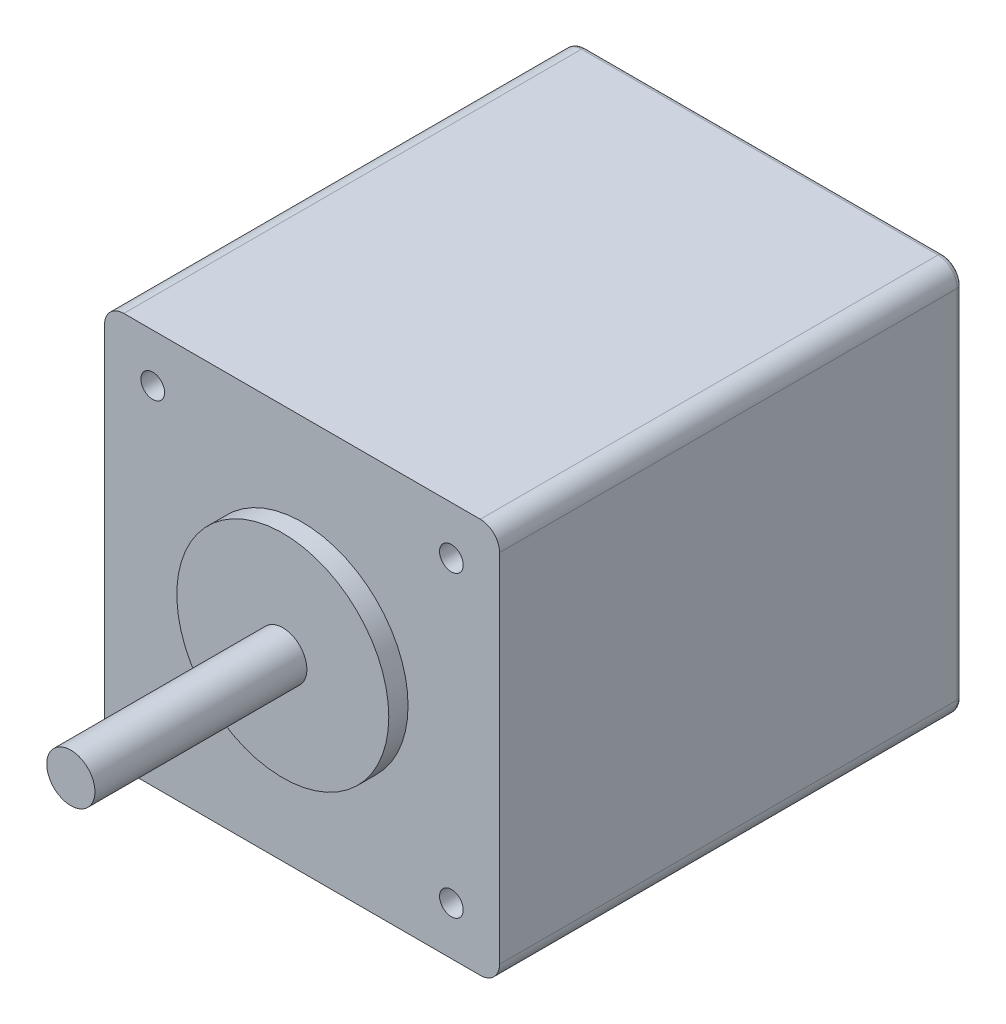
ISO-10303-21;
HEADER;
FILE_DESCRIPTION(('STEP AP214'),'2;1');
FILE_NAME('part.step','',(''),(''),'','','');
FILE_SCHEMA(('AUTOMOTIVE_DESIGN { 1 0 10303 214 1 1 1 1 }'));
ENDSEC;
DATA;
#1=APPLICATION_CONTEXT('core data for automotive mechanical design processes');
#2=APPLICATION_PROTOCOL_DEFINITION('international standard','automotive_design',2000,#1);
#3=PRODUCT_CONTEXT('',#1,'mechanical');
#4=PRODUCT('Part','Part','',(#3));
#5=PRODUCT_RELATED_PRODUCT_CATEGORY('part','',(#4));
#6=PRODUCT_DEFINITION_FORMATION('','',#4);
#7=PRODUCT_DEFINITION_CONTEXT('part definition',#1,'design');
#8=PRODUCT_DEFINITION('design','',#6,#7);
#9=PRODUCT_DEFINITION_SHAPE('','',#8);
#10=(LENGTH_UNIT() NAMED_UNIT(*) SI_UNIT(.MILLI.,.METRE.));
#11=(NAMED_UNIT(*) PLANE_ANGLE_UNIT() SI_UNIT($,.RADIAN.));
#12=(NAMED_UNIT(*) SI_UNIT($,.STERADIAN.) SOLID_ANGLE_UNIT());
#13=UNCERTAINTY_MEASURE_WITH_UNIT(LENGTH_MEASURE(1.E-05),#10,'distance_accuracy_value','');
#14=(GEOMETRIC_REPRESENTATION_CONTEXT(3) GLOBAL_UNCERTAINTY_ASSIGNED_CONTEXT((#13)) GLOBAL_UNIT_ASSIGNED_CONTEXT((#10,
#11,#12)) REPRESENTATION_CONTEXT('',''));
#15=CARTESIAN_POINT('',(0.,0.,0.));
#16=DIRECTION('',(0.,0.,1.));
#17=DIRECTION('',(1.,0.,0.));
#18=AXIS2_PLACEMENT_3D('',#15,#16,#17);
#19=CARTESIAN_POINT('',(-41.,0.,0.));
#20=DIRECTION('',(-1.,0.,0.));
#21=DIRECTION('',(0.,0.,1.));
#22=AXIS2_PLACEMENT_3D('',#19,#20,#21);
#23=PLANE('',#22);
#24=DIRECTION('',(0.,0.,1.));
#25=VECTOR('',#24,1.);
#26=CARTESIAN_POINT('',(-41.,39.,0.));
#27=LINE('',#26,#25);
#28=CARTESIAN_POINT('',(-41.,39.,48.));
#29=VERTEX_POINT('',#28);
#30=CARTESIAN_POINT('',(-41.,39.,0.499999999999999));
#31=VERTEX_POINT('',#30);
#32=EDGE_CURVE('E134',#29,#31,#27,.F.);
#33=ORIENTED_EDGE('',*,*,#32,.T.);
#34=DIRECTION('',(0.,1.,0.));
#35=VECTOR('',#34,1.);
#36=CARTESIAN_POINT('',(-41.,0.,0.499999999999999));
#37=LINE('',#36,#35);
#38=CARTESIAN_POINT('',(-41.,2.,0.5));
#39=VERTEX_POINT('',#38);
#40=EDGE_CURVE('E205',#31,#39,#37,.F.);
#41=ORIENTED_EDGE('',*,*,#40,.T.);
#42=DIRECTION('',(0.,0.,1.));
#43=VECTOR('',#42,1.);
#44=CARTESIAN_POINT('',(-41.,2.,48.));
#45=LINE('',#44,#43);
#46=CARTESIAN_POINT('',(-41.,2.,48.));
#47=VERTEX_POINT('',#46);
#48=EDGE_CURVE('E138',#39,#47,#45,.T.);
#49=ORIENTED_EDGE('',*,*,#48,.T.);
#50=DIRECTION('',(0.,1.,0.));
#51=VECTOR('',#50,1.);
#52=CARTESIAN_POINT('',(-41.,0.,48.));
#53=LINE('',#52,#51);
#54=EDGE_CURVE('E148',#47,#29,#53,.T.);
#55=ORIENTED_EDGE('',*,*,#54,.T.);
#56=EDGE_LOOP('',(#33,#41,#49,#55));
#57=FACE_BOUND('',#56,.T.);
#58=ADVANCED_FACE('F35',(#57),#23,.T.);
#59=CARTESIAN_POINT('',(0.,0.,0.));
#60=DIRECTION('',(0.,0.,-1.));
#61=DIRECTION('',(-1.,0.,0.));
#62=AXIS2_PLACEMENT_3D('',#59,#60,#61);
#63=PLANE('',#62);
#64=DIRECTION('',(0.,1.,0.));
#65=VECTOR('',#64,1.);
#66=CARTESIAN_POINT('',(-0.499999999999999,0.,0.));
#67=LINE('',#66,#65);
#68=CARTESIAN_POINT('',(-0.499999999999999,39.,0.));
#69=VERTEX_POINT('',#68);
#70=CARTESIAN_POINT('',(-0.499999999999999,2.,0.));
#71=VERTEX_POINT('',#70);
#72=EDGE_CURVE('E187',#69,#71,#67,.F.);
#73=ORIENTED_EDGE('',*,*,#72,.T.);
#74=CARTESIAN_POINT('',(-2.,2.,0.));
#75=DIRECTION('',(0.,0.,-1.));
#76=DIRECTION('',(-1.,0.,0.));
#77=AXIS2_PLACEMENT_3D('',#74,#75,#76);
#78=CIRCLE('',#77,1.5);
#79=CARTESIAN_POINT('',(-2.,0.499999999999999,0.));
#80=VERTEX_POINT('',#79);
#81=EDGE_CURVE('E191',#71,#80,#78,.T.);
#82=ORIENTED_EDGE('',*,*,#81,.T.);
#83=DIRECTION('',(-1.,0.,0.));
#84=VECTOR('',#83,1.);
#85=CARTESIAN_POINT('',(-39.,0.499999999999999,0.));
#86=LINE('',#85,#84);
#87=CARTESIAN_POINT('',(-39.,0.499999999999999,0.));
#88=VERTEX_POINT('',#87);
#89=EDGE_CURVE('E189',#80,#88,#86,.T.);
#90=ORIENTED_EDGE('',*,*,#89,.T.);
#91=CARTESIAN_POINT('',(-39.,2.,0.));
#92=DIRECTION('',(0.,0.,-1.));
#93=DIRECTION('',(-1.,0.,0.));
#94=AXIS2_PLACEMENT_3D('',#91,#92,#93);
#95=CIRCLE('',#94,1.5);
#96=CARTESIAN_POINT('',(-40.5,2.,0.));
#97=VERTEX_POINT('',#96);
#98=EDGE_CURVE('E185',#88,#97,#95,.T.);
#99=ORIENTED_EDGE('',*,*,#98,.T.);
#100=DIRECTION('',(0.,1.,0.));
#101=VECTOR('',#100,1.);
#102=CARTESIAN_POINT('',(-40.5,0.,0.));
#103=LINE('',#102,#101);
#104=CARTESIAN_POINT('',(-40.5,39.,0.));
#105=VERTEX_POINT('',#104);
#106=EDGE_CURVE('E181',#97,#105,#103,.T.);
#107=ORIENTED_EDGE('',*,*,#106,.T.);
#108=CARTESIAN_POINT('',(-39.,39.,0.));
#109=DIRECTION('',(0.,0.,-1.));
#110=DIRECTION('',(-1.,0.,0.));
#111=AXIS2_PLACEMENT_3D('',#108,#109,#110);
#112=CIRCLE('',#111,1.5);
#113=CARTESIAN_POINT('',(-39.,40.5,0.));
#114=VERTEX_POINT('',#113);
#115=EDGE_CURVE('E177',#105,#114,#112,.T.);
#116=ORIENTED_EDGE('',*,*,#115,.T.);
#117=DIRECTION('',(-1.,0.,0.));
#118=VECTOR('',#117,1.);
#119=CARTESIAN_POINT('',(0.,40.5,0.));
#120=LINE('',#119,#118);
#121=CARTESIAN_POINT('',(-2.,40.5,0.));
#122=VERTEX_POINT('',#121);
#123=EDGE_CURVE('E179',#114,#122,#120,.F.);
#124=ORIENTED_EDGE('',*,*,#123,.T.);
#125=CARTESIAN_POINT('',(-2.,39.,0.));
#126=DIRECTION('',(0.,0.,-1.));
#127=DIRECTION('',(-1.,0.,0.));
#128=AXIS2_PLACEMENT_3D('',#125,#126,#127);
#129=CIRCLE('',#128,1.5);
#130=EDGE_CURVE('E183',#122,#69,#129,.T.);
#131=ORIENTED_EDGE('',*,*,#130,.T.);
#132=EDGE_LOOP('',(#73,#82,#90,#99,#107,#116,#124,#131));
#133=FACE_BOUND('',#132,.T.);
#134=ADVANCED_FACE('F284',(#133),#63,.T.);
#135=CARTESIAN_POINT('',(0.,0.,48.));
#136=DIRECTION('',(1.,0.,0.));
#137=DIRECTION('',(0.,0.,-1.));
#138=AXIS2_PLACEMENT_3D('',#135,#136,#137);
#139=PLANE('',#138);
#140=DIRECTION('',(0.,0.,-1.));
#141=VECTOR('',#140,1.);
#142=CARTESIAN_POINT('',(0.,2.,0.));
#143=LINE('',#142,#141);
#144=CARTESIAN_POINT('',(0.,2.,48.));
#145=VERTEX_POINT('',#144);
#146=CARTESIAN_POINT('',(0.,2.,0.5));
#147=VERTEX_POINT('',#146);
#148=EDGE_CURVE('E167',#145,#147,#143,.T.);
#149=ORIENTED_EDGE('',*,*,#148,.T.);
#150=DIRECTION('',(0.,1.,0.));
#151=VECTOR('',#150,1.);
#152=CARTESIAN_POINT('',(0.,0.,0.5));
#153=LINE('',#152,#151);
#154=CARTESIAN_POINT('',(0.,39.,0.5));
#155=VERTEX_POINT('',#154);
#156=EDGE_CURVE('E199',#147,#155,#153,.T.);
#157=ORIENTED_EDGE('',*,*,#156,.T.);
#158=DIRECTION('',(0.,0.,-1.));
#159=VECTOR('',#158,1.);
#160=CARTESIAN_POINT('',(0.,39.,48.));
#161=LINE('',#160,#159);
#162=CARTESIAN_POINT('',(0.,39.,48.));
#163=VERTEX_POINT('',#162);
#164=EDGE_CURVE('E170',#155,#163,#161,.F.);
#165=ORIENTED_EDGE('',*,*,#164,.T.);
#166=DIRECTION('',(0.,1.,0.));
#167=VECTOR('',#166,1.);
#168=CARTESIAN_POINT('',(0.,0.,48.));
#169=LINE('',#168,#167);
#170=EDGE_CURVE('E154',#145,#163,#169,.T.);
#171=ORIENTED_EDGE('',*,*,#170,.F.);
#172=EDGE_LOOP('',(#149,#157,#165,#171));
#173=FACE_BOUND('',#172,.T.);
#174=ADVANCED_FACE('F290',(#173),#139,.T.);
#175=CARTESIAN_POINT('',(-41.,0.,48.));
#176=DIRECTION('',(0.,0.,1.));
#177=DIRECTION('',(1.,0.,0.));
#178=AXIS2_PLACEMENT_3D('',#175,#176,#177);
#179=PLANE('',#178);
#180=CARTESIAN_POINT('',(-36.0003389283089,4.99966098508246,48.));
#181=DIRECTION('',(0.,0.,1.));
#182=DIRECTION('',(1.,0.,0.));
#183=AXIS2_PLACEMENT_3D('',#180,#181,#182);
#184=CIRCLE('',#183,1.22949999999999);
#185=CARTESIAN_POINT('',(-34.7708389283089,4.99966098508246,48.));
#186=VERTEX_POINT('',#185);
#187=EDGE_CURVE('E230',#186,#186,#184,.T.);
#188=ORIENTED_EDGE('',*,*,#187,.F.);
#189=EDGE_LOOP('',(#188));
#190=FACE_BOUND('',#189,.T.);
#191=CARTESIAN_POINT('',(-5.0001293043338,5.00012937982356,48.));
#192=DIRECTION('',(0.,0.,1.));
#193=DIRECTION('',(1.,0.,0.));
#194=AXIS2_PLACEMENT_3D('',#191,#192,#193);
#195=CIRCLE('',#194,1.22949999999999);
#196=CARTESIAN_POINT('',(-3.77062930433381,5.00012937982356,48.));
#197=VERTEX_POINT('',#196);
#198=EDGE_CURVE('E240',#197,#197,#195,.T.);
#199=ORIENTED_EDGE('',*,*,#198,.F.);
#200=EDGE_LOOP('',(#199));
#201=FACE_BOUND('',#200,.T.);
#202=CARTESIAN_POINT('',(-4.99960623542344,36.0003938511997,48.));
#203=DIRECTION('',(0.,0.,1.));
#204=DIRECTION('',(1.,0.,0.));
#205=AXIS2_PLACEMENT_3D('',#202,#203,#204);
#206=CIRCLE('',#205,1.22949999999999);
#207=CARTESIAN_POINT('',(-3.77010623542345,36.0003938511997,48.));
#208=VERTEX_POINT('',#207);
#209=EDGE_CURVE('E248',#208,#208,#206,.T.);
#210=ORIENTED_EDGE('',*,*,#209,.F.);
#211=EDGE_LOOP('',(#210));
#212=FACE_BOUND('',#211,.T.);
#213=CARTESIAN_POINT('',(-35.9993649013313,35.9993648044757,48.));
#214=DIRECTION('',(0.,0.,1.));
#215=DIRECTION('',(1.,0.,0.));
#216=AXIS2_PLACEMENT_3D('',#213,#214,#215);
#217=CIRCLE('',#216,1.22949999999999);
#218=CARTESIAN_POINT('',(-34.7698649013313,35.9993648044757,48.));
#219=VERTEX_POINT('',#218);
#220=EDGE_CURVE('E254',#219,#219,#217,.T.);
#221=ORIENTED_EDGE('',*,*,#220,.F.);
#222=EDGE_LOOP('',(#221));
#223=FACE_BOUND('',#222,.T.);
#224=CARTESIAN_POINT('',(-20.5,20.5,48.));
#225=DIRECTION('',(0.,0.,1.));
#226=DIRECTION('',(1.,0.,0.));
#227=AXIS2_PLACEMENT_3D('',#224,#225,#226);
#228=CIRCLE('',#227,11.);
#229=CARTESIAN_POINT('',(-9.5,20.5,48.));
#230=VERTEX_POINT('',#229);
#231=EDGE_CURVE('E156',#230,#230,#228,.T.);
#232=ORIENTED_EDGE('',*,*,#231,.F.);
#233=EDGE_LOOP('',(#232));
#234=FACE_BOUND('',#233,.T.);
#235=DIRECTION('',(1.,0.,0.));
#236=VECTOR('',#235,1.);
#237=CARTESIAN_POINT('',(-41.,41.,48.));
#238=LINE('',#237,#236);
#239=CARTESIAN_POINT('',(-39.,41.,48.));
#240=VERTEX_POINT('',#239);
#241=CARTESIAN_POINT('',(-2.,41.,48.));
#242=VERTEX_POINT('',#241);
#243=EDGE_CURVE('E127',#240,#242,#238,.T.);
#244=ORIENTED_EDGE('',*,*,#243,.F.);
#245=CARTESIAN_POINT('',(-39.,39.,48.));
#246=DIRECTION('',(0.,0.,1.));
#247=DIRECTION('',(1.,0.,0.));
#248=AXIS2_PLACEMENT_3D('',#245,#246,#247);
#249=CIRCLE('',#248,2.);
#250=EDGE_CURVE('E132',#240,#29,#249,.T.);
#251=ORIENTED_EDGE('',*,*,#250,.T.);
#252=ORIENTED_EDGE('',*,*,#54,.F.);
#253=CARTESIAN_POINT('',(-39.,2.,48.));
#254=DIRECTION('',(0.,0.,1.));
#255=DIRECTION('',(1.,0.,0.));
#256=AXIS2_PLACEMENT_3D('',#253,#254,#255);
#257=CIRCLE('',#256,2.);
#258=CARTESIAN_POINT('',(-39.,0.,48.));
#259=VERTEX_POINT('',#258);
#260=EDGE_CURVE('E162',#47,#259,#257,.T.);
#261=ORIENTED_EDGE('',*,*,#260,.T.);
#262=DIRECTION('',(1.,0.,0.));
#263=VECTOR('',#262,1.);
#264=CARTESIAN_POINT('',(-41.,0.,48.));
#265=LINE('',#264,#263);
#266=CARTESIAN_POINT('',(-2.,0.,48.));
#267=VERTEX_POINT('',#266);
#268=EDGE_CURVE('E144',#259,#267,#265,.T.);
#269=ORIENTED_EDGE('',*,*,#268,.T.);
#270=CARTESIAN_POINT('',(-2.,2.,48.));
#271=DIRECTION('',(0.,0.,1.));
#272=DIRECTION('',(1.,0.,0.));
#273=AXIS2_PLACEMENT_3D('',#270,#271,#272);
#274=CIRCLE('',#273,2.);
#275=EDGE_CURVE('E129',#267,#145,#274,.T.);
#276=ORIENTED_EDGE('',*,*,#275,.T.);
#277=ORIENTED_EDGE('',*,*,#170,.T.);
#278=CARTESIAN_POINT('',(-2.,39.,48.));
#279=DIRECTION('',(0.,0.,1.));
#280=DIRECTION('',(1.,0.,0.));
#281=AXIS2_PLACEMENT_3D('',#278,#279,#280);
#282=CIRCLE('',#281,2.);
#283=EDGE_CURVE('E139',#163,#242,#282,.T.);
#284=ORIENTED_EDGE('',*,*,#283,.T.);
#285=EDGE_LOOP('',(#244,#251,#252,#261,#269,#276,#277,#284));
#286=FACE_BOUND('',#285,.T.);
#287=ADVANCED_FACE('F141',(#190,#201,#212,#223,#234,#286),#179,.T.);
#288=CARTESIAN_POINT('',(0.,0.,0.));
#289=DIRECTION('',(0.,1.,0.));
#290=DIRECTION('',(0.,0.,1.));
#291=AXIS2_PLACEMENT_3D('',#288,#289,#290);
#292=PLANE('',#291);
#293=DIRECTION('',(0.,0.,1.));
#294=VECTOR('',#293,1.);
#295=CARTESIAN_POINT('',(-39.,0.,0.));
#296=LINE('',#295,#294);
#297=CARTESIAN_POINT('',(-39.,0.,0.499999999999999));
#298=VERTEX_POINT('',#297);
#299=EDGE_CURVE('E174',#259,#298,#296,.F.);
#300=ORIENTED_EDGE('',*,*,#299,.T.);
#301=DIRECTION('',(-1.,0.,0.));
#302=VECTOR('',#301,1.);
#303=CARTESIAN_POINT('',(-2.,0.,0.499999999999999));
#304=LINE('',#303,#302);
#305=CARTESIAN_POINT('',(-2.,0.,0.5));
#306=VERTEX_POINT('',#305);
#307=EDGE_CURVE('E197',#298,#306,#304,.F.);
#308=ORIENTED_EDGE('',*,*,#307,.T.);
#309=DIRECTION('',(0.,0.,-1.));
#310=VECTOR('',#309,1.);
#311=CARTESIAN_POINT('',(-2.,0.,48.));
#312=LINE('',#311,#310);
#313=EDGE_CURVE('E172',#306,#267,#312,.F.);
#314=ORIENTED_EDGE('',*,*,#313,.T.);
#315=ORIENTED_EDGE('',*,*,#268,.F.);
#316=EDGE_LOOP('',(#300,#308,#314,#315));
#317=FACE_BOUND('',#316,.T.);
#318=ADVANCED_FACE('F350',(#317),#292,.F.);
#319=CARTESIAN_POINT('',(0.,41.,0.));
#320=DIRECTION('',(0.,1.,0.));
#321=DIRECTION('',(0.,0.,1.));
#322=AXIS2_PLACEMENT_3D('',#319,#320,#321);
#323=PLANE('',#322);
#324=DIRECTION('',(0.,0.,-1.));
#325=VECTOR('',#324,1.);
#326=CARTESIAN_POINT('',(-2.,41.,0.));
#327=LINE('',#326,#325);
#328=CARTESIAN_POINT('',(-2.,41.,0.499999999999999));
#329=VERTEX_POINT('',#328);
#330=EDGE_CURVE('E130',#242,#329,#327,.T.);
#331=ORIENTED_EDGE('',*,*,#330,.T.);
#332=DIRECTION('',(-1.,0.,0.));
#333=VECTOR('',#332,1.);
#334=CARTESIAN_POINT('',(0.,41.,0.499999999999999));
#335=LINE('',#334,#333);
#336=CARTESIAN_POINT('',(-39.,41.,0.499999999999999));
#337=VERTEX_POINT('',#336);
#338=EDGE_CURVE('E44',#329,#337,#335,.T.);
#339=ORIENTED_EDGE('',*,*,#338,.T.);
#340=DIRECTION('',(0.,0.,1.));
#341=VECTOR('',#340,1.);
#342=CARTESIAN_POINT('',(-39.,41.,0.));
#343=LINE('',#342,#341);
#344=EDGE_CURVE('E123',#337,#240,#343,.T.);
#345=ORIENTED_EDGE('',*,*,#344,.T.);
#346=ORIENTED_EDGE('',*,*,#243,.T.);
#347=EDGE_LOOP('',(#331,#339,#345,#346));
#348=FACE_BOUND('',#347,.T.);
#349=ADVANCED_FACE('F125',(#348),#323,.T.);
#350=CARTESIAN_POINT('',(-20.5,20.5,48.));
#351=DIRECTION('',(0.,0.,1.));
#352=DIRECTION('',(1.,0.,0.));
#353=AXIS2_PLACEMENT_3D('',#350,#351,#352);
#354=CYLINDRICAL_SURFACE('',#353,11.);
#355=ORIENTED_EDGE('',*,*,#231,.T.);
#356=EDGE_LOOP('',(#355));
#357=FACE_BOUND('',#356,.T.);
#358=CARTESIAN_POINT('',(-20.5,20.5,50.));
#359=DIRECTION('',(0.,0.,1.));
#360=DIRECTION('',(1.,0.,0.));
#361=AXIS2_PLACEMENT_3D('',#358,#359,#360);
#362=CIRCLE('',#361,11.);
#363=CARTESIAN_POINT('',(-9.5,20.5,50.));
#364=VERTEX_POINT('',#363);
#365=EDGE_CURVE('E260',#364,#364,#362,.T.);
#366=ORIENTED_EDGE('',*,*,#365,.F.);
#367=EDGE_LOOP('',(#366));
#368=FACE_BOUND('',#367,.T.);
#369=ADVANCED_FACE('F378',(#357,#368),#354,.T.);
#370=CARTESIAN_POINT('',(-20.5,20.5,72.));
#371=DIRECTION('',(0.,0.,1.));
#372=DIRECTION('',(1.,0.,0.));
#373=AXIS2_PLACEMENT_3D('',#370,#371,#372);
#374=PLANE('',#373);
#375=CARTESIAN_POINT('',(-20.5,20.5,72.));
#376=DIRECTION('',(0.,0.,1.));
#377=DIRECTION('',(1.,0.,0.));
#378=AXIS2_PLACEMENT_3D('',#375,#376,#377);
#379=CIRCLE('',#378,2.5);
#380=CARTESIAN_POINT('',(-18.,20.5,72.));
#381=VERTEX_POINT('',#380);
#382=EDGE_CURVE('E145',#381,#381,#379,.T.);
#383=ORIENTED_EDGE('',*,*,#382,.T.);
#384=EDGE_LOOP('',(#383));
#385=FACE_BOUND('',#384,.T.);
#386=ADVANCED_FACE('F281',(#385),#374,.T.);
#387=CARTESIAN_POINT('',(-20.5,20.5,48.));
#388=DIRECTION('',(0.,0.,1.));
#389=DIRECTION('',(1.,0.,0.));
#390=AXIS2_PLACEMENT_3D('',#387,#388,#389);
#391=CYLINDRICAL_SURFACE('',#390,2.5);
#392=CARTESIAN_POINT('',(-20.5,20.5,50.));
#393=DIRECTION('',(0.,0.,1.));
#394=DIRECTION('',(1.,0.,0.));
#395=AXIS2_PLACEMENT_3D('',#392,#393,#394);
#396=CIRCLE('',#395,2.5);
#397=CARTESIAN_POINT('',(-18.,20.5,50.));
#398=VERTEX_POINT('',#397);
#399=EDGE_CURVE('E151',#398,#398,#396,.T.);
#400=ORIENTED_EDGE('',*,*,#399,.T.);
#401=EDGE_LOOP('',(#400));
#402=FACE_BOUND('',#401,.T.);
#403=ORIENTED_EDGE('',*,*,#382,.F.);
#404=EDGE_LOOP('',(#403));
#405=FACE_BOUND('',#404,.T.);
#406=ADVANCED_FACE('F266',(#402,#405),#391,.T.);
#407=CARTESIAN_POINT('',(-18.,20.5,50.));
#408=DIRECTION('',(0.,0.,1.));
#409=DIRECTION('',(1.,0.,0.));
#410=AXIS2_PLACEMENT_3D('',#407,#408,#409);
#411=PLANE('',#410);
#412=ORIENTED_EDGE('',*,*,#365,.T.);
#413=EDGE_LOOP('',(#412));
#414=FACE_BOUND('',#413,.T.);
#415=ORIENTED_EDGE('',*,*,#399,.F.);
#416=EDGE_LOOP('',(#415));
#417=FACE_BOUND('',#416,.T.);
#418=ADVANCED_FACE('F269',(#414,#417),#411,.T.);
#419=CARTESIAN_POINT('',(-35.9993649013313,35.9993648044757,43.5));
#420=DIRECTION('',(0.,0.,-1.));
#421=DIRECTION('',(-1.,0.,0.));
#422=AXIS2_PLACEMENT_3D('',#419,#420,#421);
#423=PLANE('',#422);
#424=CARTESIAN_POINT('',(-35.9993649013313,35.9993648044757,43.5));
#425=DIRECTION('',(0.,0.,1.));
#426=DIRECTION('',(1.,0.,0.));
#427=AXIS2_PLACEMENT_3D('',#424,#425,#426);
#428=CIRCLE('',#427,1.22949999999999);
#429=CARTESIAN_POINT('',(-34.7698649013313,35.9993648044757,43.5));
#430=VERTEX_POINT('',#429);
#431=EDGE_CURVE('E257',#430,#430,#428,.T.);
#432=ORIENTED_EDGE('',*,*,#431,.T.);
#433=EDGE_LOOP('',(#432));
#434=FACE_BOUND('',#433,.T.);
#435=ADVANCED_FACE('F271',(#434),#423,.F.);
#436=CARTESIAN_POINT('',(-35.9993649013313,35.9993648044757,48.));
#437=DIRECTION('',(0.,0.,1.));
#438=DIRECTION('',(1.,0.,0.));
#439=AXIS2_PLACEMENT_3D('',#436,#437,#438);
#440=CYLINDRICAL_SURFACE('',#439,1.22949999999999);
#441=ORIENTED_EDGE('',*,*,#431,.F.);
#442=EDGE_LOOP('',(#441));
#443=FACE_BOUND('',#442,.T.);
#444=ORIENTED_EDGE('',*,*,#220,.T.);
#445=EDGE_LOOP('',(#444));
#446=FACE_BOUND('',#445,.T.);
#447=ADVANCED_FACE('F278',(#443,#446),#440,.F.);
#448=CARTESIAN_POINT('',(-4.99960623542344,36.0003938511997,43.5));
#449=DIRECTION('',(0.,0.,-1.));
#450=DIRECTION('',(-1.,0.,0.));
#451=AXIS2_PLACEMENT_3D('',#448,#449,#450);
#452=PLANE('',#451);
#453=CARTESIAN_POINT('',(-4.99960623542344,36.0003938511997,43.5));
#454=DIRECTION('',(0.,0.,1.));
#455=DIRECTION('',(1.,0.,0.));
#456=AXIS2_PLACEMENT_3D('',#453,#454,#455);
#457=CIRCLE('',#456,1.22949999999999);
#458=CARTESIAN_POINT('',(-3.77010623542345,36.0003938511997,43.5));
#459=VERTEX_POINT('',#458);
#460=EDGE_CURVE('E251',#459,#459,#457,.T.);
#461=ORIENTED_EDGE('',*,*,#460,.T.);
#462=EDGE_LOOP('',(#461));
#463=FACE_BOUND('',#462,.T.);
#464=ADVANCED_FACE('F414',(#463),#452,.F.);
#465=CARTESIAN_POINT('',(-4.99960623542344,36.0003938511997,48.));
#466=DIRECTION('',(0.,0.,1.));
#467=DIRECTION('',(1.,0.,0.));
#468=AXIS2_PLACEMENT_3D('',#465,#466,#467);
#469=CYLINDRICAL_SURFACE('',#468,1.22949999999999);
#470=ORIENTED_EDGE('',*,*,#460,.F.);
#471=EDGE_LOOP('',(#470));
#472=FACE_BOUND('',#471,.T.);
#473=ORIENTED_EDGE('',*,*,#209,.T.);
#474=EDGE_LOOP('',(#473));
#475=FACE_BOUND('',#474,.T.);
#476=ADVANCED_FACE('F424',(#472,#475),#469,.F.);
#477=CARTESIAN_POINT('',(-5.0001293043338,5.00012937982356,43.5));
#478=DIRECTION('',(0.,0.,-1.));
#479=DIRECTION('',(-1.,0.,0.));
#480=AXIS2_PLACEMENT_3D('',#477,#478,#479);
#481=PLANE('',#480);
#482=CARTESIAN_POINT('',(-5.0001293043338,5.00012937982356,43.5));
#483=DIRECTION('',(0.,0.,1.));
#484=DIRECTION('',(1.,0.,0.));
#485=AXIS2_PLACEMENT_3D('',#482,#483,#484);
#486=CIRCLE('',#485,1.22949999999999);
#487=CARTESIAN_POINT('',(-3.77062930433381,5.00012937982356,43.5));
#488=VERTEX_POINT('',#487);
#489=EDGE_CURVE('E245',#488,#488,#486,.T.);
#490=ORIENTED_EDGE('',*,*,#489,.T.);
#491=EDGE_LOOP('',(#490));
#492=FACE_BOUND('',#491,.T.);
#493=ADVANCED_FACE('F434',(#492),#481,.F.);
#494=CARTESIAN_POINT('',(-5.0001293043338,5.00012937982356,48.));
#495=DIRECTION('',(0.,0.,1.));
#496=DIRECTION('',(1.,0.,0.));
#497=AXIS2_PLACEMENT_3D('',#494,#495,#496);
#498=CYLINDRICAL_SURFACE('',#497,1.22949999999999);
#499=ORIENTED_EDGE('',*,*,#489,.F.);
#500=EDGE_LOOP('',(#499));
#501=FACE_BOUND('',#500,.T.);
#502=ORIENTED_EDGE('',*,*,#198,.T.);
#503=EDGE_LOOP('',(#502));
#504=FACE_BOUND('',#503,.T.);
#505=ADVANCED_FACE('F444',(#501,#504),#498,.F.);
#506=CARTESIAN_POINT('',(-36.0003389283089,4.99966098508246,43.5));
#507=DIRECTION('',(0.,0.,-1.));
#508=DIRECTION('',(-1.,0.,0.));
#509=AXIS2_PLACEMENT_3D('',#506,#507,#508);
#510=PLANE('',#509);
#511=CARTESIAN_POINT('',(-36.0003389283089,4.99966098508246,43.5));
#512=DIRECTION('',(0.,0.,1.));
#513=DIRECTION('',(1.,0.,0.));
#514=AXIS2_PLACEMENT_3D('',#511,#512,#513);
#515=CIRCLE('',#514,1.22949999999999);
#516=CARTESIAN_POINT('',(-34.7708389283089,4.99966098508246,43.5));
#517=VERTEX_POINT('',#516);
#518=EDGE_CURVE('E235',#517,#517,#515,.T.);
#519=ORIENTED_EDGE('',*,*,#518,.T.);
#520=EDGE_LOOP('',(#519));
#521=FACE_BOUND('',#520,.T.);
#522=ADVANCED_FACE('F454',(#521),#510,.F.);
#523=CARTESIAN_POINT('',(-36.0003389283089,4.99966098508246,48.));
#524=DIRECTION('',(0.,0.,1.));
#525=DIRECTION('',(1.,0.,0.));
#526=AXIS2_PLACEMENT_3D('',#523,#524,#525);
#527=CYLINDRICAL_SURFACE('',#526,1.22949999999999);
#528=ORIENTED_EDGE('',*,*,#518,.F.);
#529=EDGE_LOOP('',(#528));
#530=FACE_BOUND('',#529,.T.);
#531=ORIENTED_EDGE('',*,*,#187,.T.);
#532=EDGE_LOOP('',(#531));
#533=FACE_BOUND('',#532,.T.);
#534=ADVANCED_FACE('F299',(#530,#533),#527,.F.);
#535=CARTESIAN_POINT('',(-39.,39.,0.));
#536=DIRECTION('',(0.,0.,1.));
#537=DIRECTION('',(1.,0.,0.));
#538=AXIS2_PLACEMENT_3D('',#535,#536,#537);
#539=CYLINDRICAL_SURFACE('',#538,2.);
#540=ORIENTED_EDGE('',*,*,#344,.F.);
#541=CARTESIAN_POINT('',(-39.,39.,0.499999999999999));
#542=DIRECTION('',(0.,0.,-1.));
#543=DIRECTION('',(-1.,0.,0.));
#544=AXIS2_PLACEMENT_3D('',#541,#542,#543);
#545=CIRCLE('',#544,2.);
#546=EDGE_CURVE('E11',#337,#31,#545,.F.);
#547=ORIENTED_EDGE('',*,*,#546,.T.);
#548=ORIENTED_EDGE('',*,*,#32,.F.);
#549=ORIENTED_EDGE('',*,*,#250,.F.);
#550=EDGE_LOOP('',(#540,#547,#548,#549));
#551=FACE_BOUND('',#550,.T.);
#552=ADVANCED_FACE('F133',(#551),#539,.T.);
#553=CARTESIAN_POINT('',(-2.,39.,0.));
#554=DIRECTION('',(0.,0.,-1.));
#555=DIRECTION('',(-1.,0.,0.));
#556=AXIS2_PLACEMENT_3D('',#553,#554,#555);
#557=CYLINDRICAL_SURFACE('',#556,2.);
#558=ORIENTED_EDGE('',*,*,#164,.F.);
#559=CARTESIAN_POINT('',(-2.,39.,0.499999999999999));
#560=DIRECTION('',(0.,0.,-1.));
#561=DIRECTION('',(-1.,0.,0.));
#562=AXIS2_PLACEMENT_3D('',#559,#560,#561);
#563=CIRCLE('',#562,2.);
#564=EDGE_CURVE('E203',#155,#329,#563,.F.);
#565=ORIENTED_EDGE('',*,*,#564,.T.);
#566=ORIENTED_EDGE('',*,*,#330,.F.);
#567=ORIENTED_EDGE('',*,*,#283,.F.);
#568=EDGE_LOOP('',(#558,#565,#566,#567));
#569=FACE_BOUND('',#568,.T.);
#570=ADVANCED_FACE('F298',(#569),#557,.T.);
#571=CARTESIAN_POINT('',(-39.,2.,0.));
#572=DIRECTION('',(0.,0.,-1.));
#573=DIRECTION('',(-1.,0.,0.));
#574=AXIS2_PLACEMENT_3D('',#571,#572,#573);
#575=CYLINDRICAL_SURFACE('',#574,2.);
#576=ORIENTED_EDGE('',*,*,#48,.F.);
#577=CARTESIAN_POINT('',(-39.,2.,0.499999999999999));
#578=DIRECTION('',(0.,0.,-1.));
#579=DIRECTION('',(-1.,0.,0.));
#580=AXIS2_PLACEMENT_3D('',#577,#578,#579);
#581=CIRCLE('',#580,2.);
#582=EDGE_CURVE('E201',#39,#298,#581,.F.);
#583=ORIENTED_EDGE('',*,*,#582,.T.);
#584=ORIENTED_EDGE('',*,*,#299,.F.);
#585=ORIENTED_EDGE('',*,*,#260,.F.);
#586=EDGE_LOOP('',(#576,#583,#584,#585));
#587=FACE_BOUND('',#586,.T.);
#588=ADVANCED_FACE('F302',(#587),#575,.T.);
#589=CARTESIAN_POINT('',(-2.,2.,48.));
#590=DIRECTION('',(0.,0.,1.));
#591=DIRECTION('',(1.,0.,0.));
#592=AXIS2_PLACEMENT_3D('',#589,#590,#591);
#593=CYLINDRICAL_SURFACE('',#592,2.);
#594=ORIENTED_EDGE('',*,*,#313,.F.);
#595=CARTESIAN_POINT('',(-2.,2.,0.5));
#596=DIRECTION('',(0.,0.,-1.));
#597=DIRECTION('',(-1.,0.,0.));
#598=AXIS2_PLACEMENT_3D('',#595,#596,#597);
#599=CIRCLE('',#598,2.);
#600=EDGE_CURVE('E194',#306,#147,#599,.F.);
#601=ORIENTED_EDGE('',*,*,#600,.T.);
#602=ORIENTED_EDGE('',*,*,#148,.F.);
#603=ORIENTED_EDGE('',*,*,#275,.F.);
#604=EDGE_LOOP('',(#594,#601,#602,#603));
#605=FACE_BOUND('',#604,.T.);
#606=ADVANCED_FACE('F306',(#605),#593,.T.);
#607=CARTESIAN_POINT('',(-39.,39.,0.499999999999999));
#608=DIRECTION('',(0.,0.,-1.));
#609=DIRECTION('',(-1.,0.,0.));
#610=AXIS2_PLACEMENT_3D('',#607,#608,#609);
#611=TOROIDAL_SURFACE('',#610,1.5,0.499999999999999);
#612=CARTESIAN_POINT('',(-40.5,39.,0.499999999999999));
#613=DIRECTION('',(0.,-1.,0.));
#614=DIRECTION('',(0.,0.,-1.));
#615=AXIS2_PLACEMENT_3D('',#612,#613,#614);
#616=CIRCLE('',#615,0.499999999999999);
#617=EDGE_CURVE('E223',#31,#105,#616,.T.);
#618=ORIENTED_EDGE('',*,*,#617,.F.);
#619=ORIENTED_EDGE('',*,*,#546,.F.);
#620=CARTESIAN_POINT('',(-39.,40.5,0.499999999999999));
#621=DIRECTION('',(1.,0.,0.));
#622=DIRECTION('',(0.,0.,-1.));
#623=AXIS2_PLACEMENT_3D('',#620,#621,#622);
#624=CIRCLE('',#623,0.499999999999999);
#625=EDGE_CURVE('E39',#114,#337,#624,.T.);
#626=ORIENTED_EDGE('',*,*,#625,.F.);
#627=ORIENTED_EDGE('',*,*,#115,.F.);
#628=EDGE_LOOP('',(#618,#619,#626,#627));
#629=FACE_BOUND('',#628,.T.);
#630=ADVANCED_FACE('F37',(#629),#611,.T.);
#631=CARTESIAN_POINT('',(0.,40.5,0.499999999999999));
#632=DIRECTION('',(-1.,0.,0.));
#633=DIRECTION('',(0.,0.,1.));
#634=AXIS2_PLACEMENT_3D('',#631,#632,#633);
#635=CYLINDRICAL_SURFACE('',#634,0.499999999999999);
#636=ORIENTED_EDGE('',*,*,#625,.T.);
#637=ORIENTED_EDGE('',*,*,#338,.F.);
#638=CARTESIAN_POINT('',(-2.,40.5,0.499999999999999));
#639=DIRECTION('',(1.,0.,0.));
#640=DIRECTION('',(0.,0.,-1.));
#641=AXIS2_PLACEMENT_3D('',#638,#639,#640);
#642=CIRCLE('',#641,0.499999999999999);
#643=EDGE_CURVE('E221',#122,#329,#642,.T.);
#644=ORIENTED_EDGE('',*,*,#643,.F.);
#645=ORIENTED_EDGE('',*,*,#123,.F.);
#646=EDGE_LOOP('',(#636,#637,#644,#645));
#647=FACE_BOUND('',#646,.T.);
#648=ADVANCED_FACE('F333',(#647),#635,.T.);
#649=CARTESIAN_POINT('',(-40.5,0.,0.499999999999999));
#650=DIRECTION('',(0.,1.,0.));
#651=DIRECTION('',(0.,0.,1.));
#652=AXIS2_PLACEMENT_3D('',#649,#650,#651);
#653=CYLINDRICAL_SURFACE('',#652,0.499999999999999);
#654=ORIENTED_EDGE('',*,*,#617,.T.);
#655=ORIENTED_EDGE('',*,*,#106,.F.);
#656=CARTESIAN_POINT('',(-40.5,2.,0.499999999999999));
#657=DIRECTION('',(0.,-1.,0.));
#658=DIRECTION('',(0.,0.,-1.));
#659=AXIS2_PLACEMENT_3D('',#656,#657,#658);
#660=CIRCLE('',#659,0.499999999999999);
#661=EDGE_CURVE('E218',#39,#97,#660,.T.);
#662=ORIENTED_EDGE('',*,*,#661,.F.);
#663=ORIENTED_EDGE('',*,*,#40,.F.);
#664=EDGE_LOOP('',(#654,#655,#662,#663));
#665=FACE_BOUND('',#664,.T.);
#666=ADVANCED_FACE('F330',(#665),#653,.T.);
#667=CARTESIAN_POINT('',(-2.,39.,0.499999999999999));
#668=DIRECTION('',(0.,0.,-1.));
#669=DIRECTION('',(-1.,0.,0.));
#670=AXIS2_PLACEMENT_3D('',#667,#668,#669);
#671=TOROIDAL_SURFACE('',#670,1.5,0.499999999999999);
#672=ORIENTED_EDGE('',*,*,#643,.T.);
#673=ORIENTED_EDGE('',*,*,#564,.F.);
#674=CARTESIAN_POINT('',(-0.499999999999999,39.,0.499999999999999));
#675=DIRECTION('',(0.,-1.,0.));
#676=DIRECTION('',(0.,0.,-1.));
#677=AXIS2_PLACEMENT_3D('',#674,#675,#676);
#678=CIRCLE('',#677,0.499999999999999);
#679=EDGE_CURVE('E215',#69,#155,#678,.T.);
#680=ORIENTED_EDGE('',*,*,#679,.F.);
#681=ORIENTED_EDGE('',*,*,#130,.F.);
#682=EDGE_LOOP('',(#672,#673,#680,#681));
#683=FACE_BOUND('',#682,.T.);
#684=ADVANCED_FACE('F326',(#683),#671,.T.);
#685=CARTESIAN_POINT('',(-39.,2.,0.499999999999999));
#686=DIRECTION('',(0.,0.,-1.));
#687=DIRECTION('',(-1.,0.,0.));
#688=AXIS2_PLACEMENT_3D('',#685,#686,#687);
#689=TOROIDAL_SURFACE('',#688,1.5,0.499999999999999);
#690=ORIENTED_EDGE('',*,*,#661,.T.);
#691=ORIENTED_EDGE('',*,*,#98,.F.);
#692=CARTESIAN_POINT('',(-39.,0.499999999999999,0.499999999999999));
#693=DIRECTION('',(1.,0.,0.));
#694=DIRECTION('',(0.,0.,-1.));
#695=AXIS2_PLACEMENT_3D('',#692,#693,#694);
#696=CIRCLE('',#695,0.499999999999999);
#697=EDGE_CURVE('E212',#298,#88,#696,.T.);
#698=ORIENTED_EDGE('',*,*,#697,.F.);
#699=ORIENTED_EDGE('',*,*,#582,.F.);
#700=EDGE_LOOP('',(#690,#691,#698,#699));
#701=FACE_BOUND('',#700,.T.);
#702=ADVANCED_FACE('F322',(#701),#689,.T.);
#703=CARTESIAN_POINT('',(-0.499999999999999,0.,0.5));
#704=DIRECTION('',(0.,1.,0.));
#705=DIRECTION('',(0.,0.,1.));
#706=AXIS2_PLACEMENT_3D('',#703,#704,#705);
#707=CYLINDRICAL_SURFACE('',#706,0.499999999999999);
#708=ORIENTED_EDGE('',*,*,#679,.T.);
#709=ORIENTED_EDGE('',*,*,#156,.F.);
#710=CARTESIAN_POINT('',(-0.499999999999999,2.,0.499999999999999));
#711=DIRECTION('',(0.,-1.,0.));
#712=DIRECTION('',(0.,0.,-1.));
#713=AXIS2_PLACEMENT_3D('',#710,#711,#712);
#714=CIRCLE('',#713,0.499999999999999);
#715=EDGE_CURVE('E210',#71,#147,#714,.T.);
#716=ORIENTED_EDGE('',*,*,#715,.F.);
#717=ORIENTED_EDGE('',*,*,#72,.F.);
#718=EDGE_LOOP('',(#708,#709,#716,#717));
#719=FACE_BOUND('',#718,.T.);
#720=ADVANCED_FACE('F318',(#719),#707,.T.);
#721=CARTESIAN_POINT('',(0.,0.499999999999999,0.499999999999999));
#722=DIRECTION('',(1.,0.,0.));
#723=DIRECTION('',(0.,0.,-1.));
#724=AXIS2_PLACEMENT_3D('',#721,#722,#723);
#725=CYLINDRICAL_SURFACE('',#724,0.499999999999999);
#726=ORIENTED_EDGE('',*,*,#697,.T.);
#727=ORIENTED_EDGE('',*,*,#89,.F.);
#728=CARTESIAN_POINT('',(-2.,0.499999999999999,0.499999999999999));
#729=DIRECTION('',(1.,0.,0.));
#730=DIRECTION('',(0.,0.,-1.));
#731=AXIS2_PLACEMENT_3D('',#728,#729,#730);
#732=CIRCLE('',#731,0.499999999999999);
#733=EDGE_CURVE('E208',#306,#80,#732,.T.);
#734=ORIENTED_EDGE('',*,*,#733,.F.);
#735=ORIENTED_EDGE('',*,*,#307,.F.);
#736=EDGE_LOOP('',(#726,#727,#734,#735));
#737=FACE_BOUND('',#736,.T.);
#738=ADVANCED_FACE('F314',(#737),#725,.T.);
#739=CARTESIAN_POINT('',(-2.,2.,0.5));
#740=DIRECTION('',(0.,0.,-1.));
#741=DIRECTION('',(-1.,0.,0.));
#742=AXIS2_PLACEMENT_3D('',#739,#740,#741);
#743=TOROIDAL_SURFACE('',#742,1.5,0.499999999999999);
#744=ORIENTED_EDGE('',*,*,#715,.T.);
#745=ORIENTED_EDGE('',*,*,#600,.F.);
#746=ORIENTED_EDGE('',*,*,#733,.T.);
#747=ORIENTED_EDGE('',*,*,#81,.F.);
#748=EDGE_LOOP('',(#744,#745,#746,#747));
#749=FACE_BOUND('',#748,.T.);
#750=ADVANCED_FACE('F311',(#749),#743,.T.);
#751=CLOSED_SHELL('',(#58,#134,#174,#287,#318,#349,#369,#386,#406,#418,#435,#447,#464,#476,#493,
#505,#522,#534,#552,#570,#588,#606,#630,#648,#666,#684,#702,#720,#738,#750));
#752=MANIFOLD_SOLID_BREP('B2',#751);
#753=ADVANCED_BREP_SHAPE_REPRESENTATION('',(#18,#752),#14);
#754=SHAPE_DEFINITION_REPRESENTATION(#9,#753);
ENDSEC;
END-ISO-10303-21;
